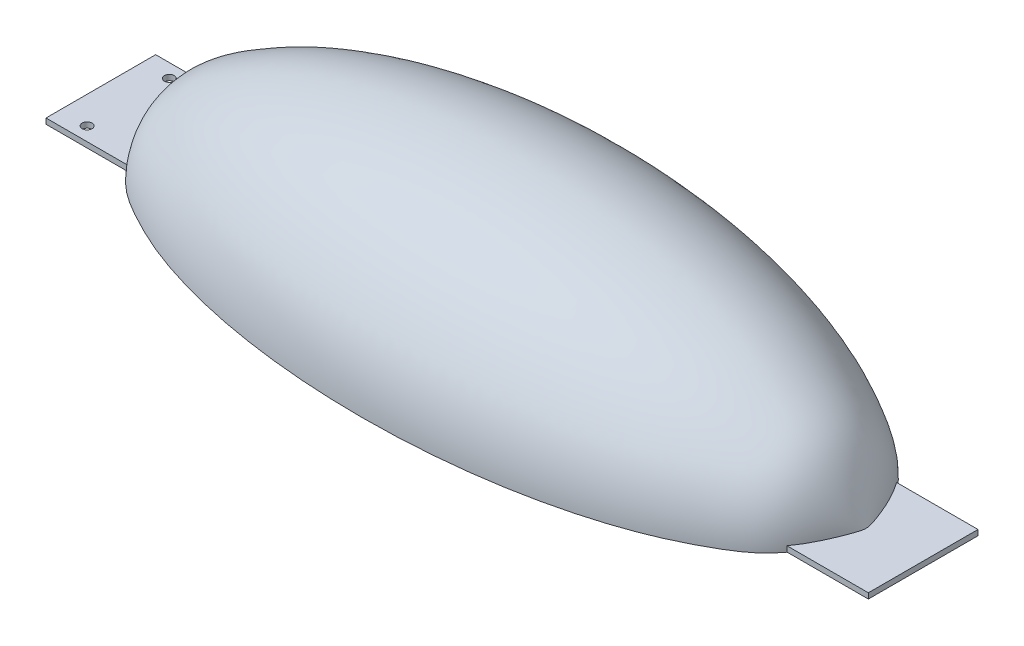
ISO-10303-21;
HEADER;
FILE_DESCRIPTION(('STEP AP214'),'2;1');
FILE_NAME('part.step','',(''),(''),'','','');
FILE_SCHEMA(('AUTOMOTIVE_DESIGN { 1 0 10303 214 1 1 1 1 }'));
ENDSEC;
DATA;
#1=APPLICATION_CONTEXT('core data for automotive mechanical design processes');
#2=APPLICATION_PROTOCOL_DEFINITION('international standard','automotive_design',2000,#1);
#3=PRODUCT_CONTEXT('',#1,'mechanical');
#4=PRODUCT('Part','Part','',(#3));
#5=PRODUCT_RELATED_PRODUCT_CATEGORY('part','',(#4));
#6=PRODUCT_DEFINITION_FORMATION('','',#4);
#7=PRODUCT_DEFINITION_CONTEXT('part definition',#1,'design');
#8=PRODUCT_DEFINITION('design','',#6,#7);
#9=PRODUCT_DEFINITION_SHAPE('','',#8);
#10=(LENGTH_UNIT() NAMED_UNIT(*) SI_UNIT(.MILLI.,.METRE.));
#11=(NAMED_UNIT(*) PLANE_ANGLE_UNIT() SI_UNIT($,.RADIAN.));
#12=(NAMED_UNIT(*) SI_UNIT($,.STERADIAN.) SOLID_ANGLE_UNIT());
#13=UNCERTAINTY_MEASURE_WITH_UNIT(LENGTH_MEASURE(1.E-05),#10,'distance_accuracy_value','');
#14=(GEOMETRIC_REPRESENTATION_CONTEXT(3) GLOBAL_UNCERTAINTY_ASSIGNED_CONTEXT((#13)) GLOBAL_UNIT_ASSIGNED_CONTEXT((#10,
#11,#12)) REPRESENTATION_CONTEXT('',''));
#15=CARTESIAN_POINT('',(0.,0.,0.));
#16=DIRECTION('',(0.,0.,1.));
#17=DIRECTION('',(1.,0.,0.));
#18=AXIS2_PLACEMENT_3D('',#15,#16,#17);
#19=CARTESIAN_POINT('',(0.,0.,0.));
#20=CARTESIAN_POINT('',(-3.34728760807037,8.83049174672856,0.));
#21=CARTESIAN_POINT('',(-8.63705775619277,22.7854538248196,0.));
#22=CARTESIAN_POINT('',(-25.5609998762051,33.0215736095755,0.));
#23=CARTESIAN_POINT('',(-38.692183286296,39.4341991765542,0.));
#24=CARTESIAN_POINT('',(-51.8523498148389,44.1237948844508,0.));
#25=CARTESIAN_POINT('',(-64.8994842203684,47.7493668098657,0.));
#26=CARTESIAN_POINT('',(-77.9365733841035,50.5149561525374,0.));
#27=CARTESIAN_POINT('',(-90.9583058600053,52.5666161858214,0.));
#28=CARTESIAN_POINT('',(-103.974926364924,53.9838858887368,0.));
#29=CARTESIAN_POINT('',(-116.988117971928,54.8167434728398,0.));
#30=CARTESIAN_POINT('',(-130.,55.09154413207,0.));
#31=CARTESIAN_POINT('',(-143.011882028072,54.8167434728398,0.));
#32=CARTESIAN_POINT('',(-156.025073635076,53.9838858887368,0.));
#33=CARTESIAN_POINT('',(-169.041694139995,52.5666161858215,0.));
#34=CARTESIAN_POINT('',(-182.063426615897,50.5149561525374,0.));
#35=CARTESIAN_POINT('',(-195.100515779632,47.7493668098658,0.));
#36=CARTESIAN_POINT('',(-208.147650185161,44.1237948844508,0.));
#37=CARTESIAN_POINT('',(-221.307816713704,39.4341991765542,0.));
#38=CARTESIAN_POINT('',(-234.439000123795,33.0215736095755,0.));
#39=CARTESIAN_POINT('',(-251.362942243807,22.7854538248196,0.));
#40=CARTESIAN_POINT('',(-256.65271239193,8.83049174672855,0.));
#41=CARTESIAN_POINT('',(-260.,0.,0.));
#42=B_SPLINE_CURVE_WITH_KNOTS('',3,(#19,#20,#21,#22,#23,#24,#25,#26,#27,#28,#29,#30,#31,#32,#33,
#34,#35,#36,#37,#38,#39,#40,#41),.UNSPECIFIED.,.F.,.F.,(4,1,1,1,1,1,1,1,1,1,1,1,1,1,1,1,1,1,1,1,
4),(0.,0.0906486460239755,0.143253451107467,0.191238799417706,0.237211897792108,
0.282076784868716,0.326262315991929,0.370011280436096,0.41347975066247,0.456779596040452,0.5,
0.543220403959548,0.58652024933753,0.629988719563904,0.673737684008071,0.717923215131284,
0.762788102207892,0.808761200582294,0.856746548892532,0.909351353976025,1.),.UNSPECIFIED.);
#43=CARTESIAN_POINT('',(10.,0.,0.));
#44=DIRECTION('',(1.,0.,0.));
#45=AXIS1_PLACEMENT('',#43,#44);
#46=SURFACE_OF_REVOLUTION('',#42,#45);
#47=CARTESIAN_POINT('',(-250.309050644008,2.,-20.));
#48=CARTESIAN_POINT('',(-250.478001383898,2.,-19.7691809663855));
#49=CARTESIAN_POINT('',(-250.644336825609,2.,-19.5364561920275));
#50=CARTESIAN_POINT('',(-250.971881417231,2.,-19.0675496964035));
#51=CARTESIAN_POINT('',(-251.133092384855,2.,-18.8313692453147));
#52=CARTESIAN_POINT('',(-251.450587417086,2.,-18.3557787321068));
#53=CARTESIAN_POINT('',(-251.606872281404,2.,-18.1163692033064));
#54=CARTESIAN_POINT('',(-251.914716801252,2.,-17.6345432726316));
#55=CARTESIAN_POINT('',(-252.066276598858,2.,-17.3921269614738));
#56=CARTESIAN_POINT('',(-252.362672385244,2.,-16.9080976009549));
#57=CARTESIAN_POINT('',(-252.507574398941,2.,-16.6665249480298));
#58=CARTESIAN_POINT('',(-252.793172089984,2.,-16.1808861484684));
#59=CARTESIAN_POINT('',(-252.933867488965,2.,-15.9368198382459));
#60=CARTESIAN_POINT('',(-253.211236957906,2.,-15.4464019747639));
#61=CARTESIAN_POINT('',(-253.347910874852,2.,-15.200050335016));
#62=CARTESIAN_POINT('',(-253.617418150724,2.,-14.7052689766137));
#63=CARTESIAN_POINT('',(-253.750251646913,2.,-14.4568393326403));
#64=CARTESIAN_POINT('',(-254.066849373885,2.,-13.854185075417));
#65=CARTESIAN_POINT('',(-254.248780868304,2.,-13.4989966764625));
#66=CARTESIAN_POINT('',(-254.605873424121,2.,-12.7852344627415));
#67=CARTESIAN_POINT('',(-254.781034403697,2.,-12.4266606071271));
#68=CARTESIAN_POINT('',(-255.125128950887,2.,-11.7064792757082));
#69=CARTESIAN_POINT('',(-255.294061648743,2.,-11.3448713848024));
#70=CARTESIAN_POINT('',(-255.626192570108,2.,-10.6189537094252));
#71=CARTESIAN_POINT('',(-255.789389721235,2.,-10.2546434349456));
#72=CARTESIAN_POINT('',(-256.112626269146,2.,-9.51873573071706));
#73=CARTESIAN_POINT('',(-256.272593004099,2.,-9.14710641792657));
#74=CARTESIAN_POINT('',(-256.587404593219,2.,-8.40172233734678));
#75=CARTESIAN_POINT('',(-256.742249867676,2.,-8.02796774693184));
#76=CARTESIAN_POINT('',(-257.046995377677,2.,-7.2785883437464));
#77=CARTESIAN_POINT('',(-257.196897174187,2.,-6.90296416528669));
#78=CARTESIAN_POINT('',(-257.491674818638,2.,-6.1499886303511));
#79=CARTESIAN_POINT('',(-257.636553450071,2.,-5.77263836595591));
#80=CARTESIAN_POINT('',(-257.835638107045,2.,-5.24237291666156));
#81=CARTESIAN_POINT('',(-257.892201373893,2.,-5.0903407664297));
#82=CARTESIAN_POINT('',(-258.004322468176,2.,-4.78589465521209));
#83=CARTESIAN_POINT('',(-258.059880231494,2.,-4.63348067057817));
#84=CARTESIAN_POINT('',(-258.169870565432,2.,-4.32816970223578));
#85=CARTESIAN_POINT('',(-258.224302620953,2.,-4.17527253277409));
#86=CARTESIAN_POINT('',(-258.331845424168,2.,-3.86886614149191));
#87=CARTESIAN_POINT('',(-258.384954999361,2.,-3.71535650739729));
#88=CARTESIAN_POINT('',(-258.489547234221,2.,-3.40755662990173));
#89=CARTESIAN_POINT('',(-258.541027656995,2.,-3.25326562424601));
#90=CARTESIAN_POINT('',(-258.64071794378,2.,-2.94724771677224));
#91=CARTESIAN_POINT('',(-258.688974044679,2.,-2.79553594136142));
#92=CARTESIAN_POINT('',(-258.782657036082,2.,-2.49123916063963));
#93=CARTESIAN_POINT('',(-258.828083982938,2.,-2.33865417278745));
#94=CARTESIAN_POINT('',(-258.914950607262,2.,-2.03252667591489));
#95=CARTESIAN_POINT('',(-258.956394741742,2.,-1.87898544688231));
#96=CARTESIAN_POINT('',(-259.033600764058,2.,-1.57071813982823));
#97=CARTESIAN_POINT('',(-259.069371534991,2.,-1.4159943197589));
#98=CARTESIAN_POINT('',(-259.132820475644,2.,-1.10490573689341));
#99=CARTESIAN_POINT('',(-259.160502508904,2.,-0.948541794585765));
#100=CARTESIAN_POINT('',(-259.195993636137,2.,-0.696000135623717));
#101=CARTESIAN_POINT('',(-259.207337254486,2.,-0.600322094010236));
#102=CARTESIAN_POINT('',(-259.225242297539,2.,-0.408512786124293));
#103=CARTESIAN_POINT('',(-259.231803937653,2.,-0.312381540463362));
#104=CARTESIAN_POINT('',(-259.239692212206,2.,-0.119968936484718));
#105=CARTESIAN_POINT('',(-259.241022596909,2.,-0.0236877352253521));
#106=CARTESIAN_POINT('',(-259.238361464156,2.,0.168704377774701));
#107=CARTESIAN_POINT('',(-259.234375193338,2.,0.264815363814678));
#108=CARTESIAN_POINT('',(-259.221325779283,2.,0.457446820096666));
#109=CARTESIAN_POINT('',(-259.212222803524,2.,0.553964532722928));
#110=CARTESIAN_POINT('',(-259.189489253683,2.,0.746536588196075));
#111=CARTESIAN_POINT('',(-259.175854899861,2.,0.842590476067346));
#112=CARTESIAN_POINT('',(-259.144757833675,2.,1.03418286650689));
#113=CARTESIAN_POINT('',(-259.127290643909,2.,1.12972063129189));
#114=CARTESIAN_POINT('',(-259.089226328873,2.,1.32023125965645));
#115=CARTESIAN_POINT('',(-259.068627056931,1.99999999999999,1.41520368901551));
#116=CARTESIAN_POINT('',(-259.018430410895,1.99999999999999,1.63271285144118));
#117=CARTESIAN_POINT('',(-258.987978499037,2.,1.75505112648353));
#118=CARTESIAN_POINT('',(-258.923924688767,2.,1.99890524389586));
#119=CARTESIAN_POINT('',(-258.890322421197,2.,2.12042098808878));
#120=CARTESIAN_POINT('',(-258.820753905258,2.,2.36271727344103));
#121=CARTESIAN_POINT('',(-258.784788611674,2.,2.4834980902572));
#122=CARTESIAN_POINT('',(-258.711024224576,2.,2.72449998299642));
#123=CARTESIAN_POINT('',(-258.673225069623,2.,2.84472104001846));
#124=CARTESIAN_POINT('',(-258.557634243335,2.,3.20486437608793));
#125=CARTESIAN_POINT('',(-258.477699087933,2.,3.44409769927359));
#126=CARTESIAN_POINT('',(-258.313980264613,2.,3.92141335786969));
#127=CARTESIAN_POINT('',(-258.230194009556,2.,4.15949479717849));
#128=CARTESIAN_POINT('',(-258.059747493118,2.,4.63471106554169));
#129=CARTESIAN_POINT('',(-257.973086321096,2.,4.87184556748117));
#130=CARTESIAN_POINT('',(-257.797445237254,2.,5.34521974952492));
#131=CARTESIAN_POINT('',(-257.708465608573,2.,5.5814595348972));
#132=CARTESIAN_POINT('',(-257.527563165618,2.,6.05545338282216));
#133=CARTESIAN_POINT('',(-257.435620098003,2.,6.29319971123576));
#134=CARTESIAN_POINT('',(-257.249827227634,2.,6.76773442660109));
#135=CARTESIAN_POINT('',(-257.155978950273,2.,7.00452341098628));
#136=CARTESIAN_POINT('',(-256.966394734895,2.,7.47719546839438));
#137=CARTESIAN_POINT('',(-256.870659848072,2.,7.71307896302847));
#138=CARTESIAN_POINT('',(-256.677263928358,2.,8.18396809287728));
#139=CARTESIAN_POINT('',(-256.579603513316,2.,8.41897398180426));
#140=CARTESIAN_POINT('',(-256.382278953887,2.,8.88811993199698));
#141=CARTESIAN_POINT('',(-256.282614979978,2.,9.12226006493765));
#142=CARTESIAN_POINT('',(-256.081177860005,2.,9.58967456850021));
#143=CARTESIAN_POINT('',(-255.97940438793,2.,9.82294879863304));
#144=CARTESIAN_POINT('',(-255.746547585351,2.,10.3498916555859));
#145=CARTESIAN_POINT('',(-255.614809774354,2.,10.6432715224734));
#146=CARTESIAN_POINT('',(-255.347554020925,2.,11.2284353752421));
#147=CARTESIAN_POINT('',(-255.212034710712,2.,11.5202187367966));
#148=CARTESIAN_POINT('',(-254.9369854495,2.,12.10195306111));
#149=CARTESIAN_POINT('',(-254.797454801961,2.,12.3919036948348));
#150=CARTESIAN_POINT('',(-254.51413454604,2.,12.9697266446384));
#151=CARTESIAN_POINT('',(-254.370344841288,2.,13.2575989135064));
#152=CARTESIAN_POINT('',(-254.078243559249,2.,13.8310120938761));
#153=CARTESIAN_POINT('',(-253.929932358062,2.,14.1165531967936));
#154=CARTESIAN_POINT('',(-253.628513131954,2.,14.6850452511039));
#155=CARTESIAN_POINT('',(-253.475405759902,2.,14.9679965483107));
#156=CARTESIAN_POINT('',(-253.168513230073,2.,15.5230790458907));
#157=CARTESIAN_POINT('',(-253.014871004611,2.,15.7952892116582));
#158=CARTESIAN_POINT('',(-252.702522257041,2.,16.336761618489));
#159=CARTESIAN_POINT('',(-252.543816146824,2.,16.6060240969338));
#160=CARTESIAN_POINT('',(-252.221068569377,2.,17.1413421130794));
#161=CARTESIAN_POINT('',(-252.05702700197,2.,17.4073975904385));
#162=CARTESIAN_POINT('',(-251.72333225987,2.,17.9360388794079));
#163=CARTESIAN_POINT('',(-251.553678031275,2.,18.1986240262839));
#164=CARTESIAN_POINT('',(-251.208475271184,2.,18.7200600593717));
#165=CARTESIAN_POINT('',(-251.032924207145,2.,18.9789092710625));
#166=CARTESIAN_POINT('',(-250.675646158141,2.,19.4926012938187));
#167=CARTESIAN_POINT('',(-250.493914560872,2.,19.7474408956102));
#168=CARTESIAN_POINT('',(-250.309050644008,2.00000000000001,20.));
#169=B_SPLINE_CURVE_WITH_KNOTS('',3,(#47,#48,#49,#50,#51,#52,#53,#54,#55,#56,#57,#58,#59,#60,
#61,#62,#63,#64,#65,#66,#67,#68,#69,#70,#71,#72,#73,#74,#75,#76,#77,#78,#79,#80,#81,#82,#83,#84,
#85,#86,#87,#88,#89,#90,#91,#92,#93,#94,#95,#96,#97,#98,#99,#100,#101,#102,#103,#104,#105,#106,
#107,#108,#109,#110,#111,#112,#113,#114,#115,#116,#117,#118,#119,#120,#121,#122,#123,#124,#125,
#126,#127,#128,#129,#130,#131,#132,#133,#134,#135,#136,#137,#138,#139,#140,#141,#142,#143,#144,
#145,#146,#147,#148,#149,#150,#151,#152,#153,#154,#155,#156,#157,#158,#159,#160,#161,#162,#163,
#164,#165,#166,#167,#168),.UNSPECIFIED.,.F.,.F.,(4,2,2,2,2,2,2,2,2,2,2,2,2,2,2,2,2,2,2,2,2,2,2,
2,2,2,2,2,2,2,2,2,2,2,2,2,2,2,2,2,2,2,2,2,2,2,2,2,2,2,2,2,2,2,2,2,2,2,2,2,4),(0.,
0.858106814571358,1.71590577253736,2.5735647492429,3.43119791251744,4.2762482191728,
5.12135432247798,5.96649254044273,6.8116005145965,8.00873079528431,9.20587553874638,
10.4031868306414,11.6007208066287,12.8144672813608,14.02811390236,15.2413735564489,
16.4539497965115,16.9405873019487,17.4272557306537,17.9141421302539,18.4014458477312,
18.889391931276,19.3669763028702,19.8445511588922,20.3215851994186,20.797864786327,
21.273916507661,21.5628601143324,21.8517907043573,22.1405141235692,22.4289528323458,
22.7196687119524,23.0106276964047,23.3019283971304,23.5934296575611,23.9715838532169,
24.3497824163232,24.7278290962741,25.105888450211,25.8625359665132,26.6196994420597,
27.3771050859677,28.1344186618474,28.8991260260274,29.663243559271,30.4269467438978,
31.1904087418137,31.9538060511373,32.717322232596,33.6820972823593,34.6472259376011,
35.6125232051471,36.5778423311566,37.5430813794942,38.5081896029243,39.4458688980326,
40.3834721166226,41.3210929493581,42.2588908516175,43.1970967977563,44.1360189566032),.UNSPECIFIED.);
#170=CARTESIAN_POINT('',(-250.309050644008,2.,-20.));
#171=VERTEX_POINT('',#170);
#172=CARTESIAN_POINT('',(-250.309050644008,2.,20.));
#173=VERTEX_POINT('',#172);
#174=EDGE_CURVE('E11',#171,#173,#169,.T.);
#175=ORIENTED_EDGE('',*,*,#174,.T.);
#176=CARTESIAN_POINT('',(-250.309050644008,2.,20.));
#177=CARTESIAN_POINT('',(-250.333418906554,1.66711202578357,20.));
#178=CARTESIAN_POINT('',(-250.351697099299,1.33400137200873,20.));
#179=CARTESIAN_POINT('',(-250.376073345186,0.667334705342215,20.));
#180=CARTESIAN_POINT('',(-250.382171398328,0.333778692450544,20.));
#181=CARTESIAN_POINT('',(-250.38217938167,4.57966997657877E-13,20.));
#182=B_SPLINE_CURVE_WITH_KNOTS('',3,(#176,#177,#178,#179,#180,#181),.UNSPECIFIED.,.F.,.F.,(4,2,
4),(0.,1.0008352511252,2.00167050225041),.UNSPECIFIED.);
#183=CARTESIAN_POINT('',(-250.382179381663,0.,20.));
#184=VERTEX_POINT('',#183);
#185=EDGE_CURVE('E111',#173,#184,#182,.T.);
#186=ORIENTED_EDGE('',*,*,#185,.T.);
#187=CARTESIAN_POINT('',(0.,0.,0.));
#188=CARTESIAN_POINT('',(-3.34728760807037,0.,8.83049174672856));
#189=CARTESIAN_POINT('',(-8.63705775619277,0.,22.7854538248196));
#190=CARTESIAN_POINT('',(-25.5609998762051,0.,33.0215736095755));
#191=CARTESIAN_POINT('',(-38.692183286296,0.,39.4341991765542));
#192=CARTESIAN_POINT('',(-51.8523498148389,0.,44.1237948844508));
#193=CARTESIAN_POINT('',(-64.8994842203684,0.,47.7493668098657));
#194=CARTESIAN_POINT('',(-77.9365733841035,0.,50.5149561525374));
#195=CARTESIAN_POINT('',(-90.9583058600053,0.,52.5666161858214));
#196=CARTESIAN_POINT('',(-103.974926364924,0.,53.9838858887368));
#197=CARTESIAN_POINT('',(-116.988117971928,0.,54.8167434728398));
#198=CARTESIAN_POINT('',(-130.,0.,55.09154413207));
#199=CARTESIAN_POINT('',(-143.011882028072,0.,54.8167434728398));
#200=CARTESIAN_POINT('',(-156.025073635076,0.,53.9838858887368));
#201=CARTESIAN_POINT('',(-169.041694139995,0.,52.5666161858215));
#202=CARTESIAN_POINT('',(-182.063426615897,0.,50.5149561525374));
#203=CARTESIAN_POINT('',(-195.100515779632,0.,47.7493668098658));
#204=CARTESIAN_POINT('',(-208.147650185161,0.,44.1237948844508));
#205=CARTESIAN_POINT('',(-221.307816713704,0.,39.4341991765542));
#206=CARTESIAN_POINT('',(-234.439000123795,0.,33.0215736095755));
#207=CARTESIAN_POINT('',(-251.362942243807,0.,22.7854538248196));
#208=CARTESIAN_POINT('',(-256.65271239193,0.,8.83049174672855));
#209=CARTESIAN_POINT('',(-260.,0.,0.));
#210=B_SPLINE_CURVE_WITH_KNOTS('',3,(#187,#188,#189,#190,#191,#192,#193,#194,#195,#196,#197,
#198,#199,#200,#201,#202,#203,#204,#205,#206,#207,#208,#209),.UNSPECIFIED.,.F.,.F.,(4,1,1,1,1,1,
1,1,1,1,1,1,1,1,1,1,1,1,1,1,4),(0.,0.0906486460239755,0.143253451107467,0.191238799417706,
0.237211897792108,0.282076784868716,0.326262315991929,0.370011280436096,0.41347975066247,
0.456779596040452,0.5,0.543220403959548,0.58652024933753,0.629988719563904,0.673737684008071,
0.717923215131284,0.762788102207892,0.808761200582294,0.856746548892532,0.909351353976025,1.),.UNSPECIFIED.);
#211=CARTESIAN_POINT('',(-9.61782061833673,0.,20.0000000000086));
#212=VERTEX_POINT('',#211);
#213=EDGE_CURVE('E217',#184,#212,#210,.F.);
#214=ORIENTED_EDGE('',*,*,#213,.T.);
#215=CARTESIAN_POINT('',(-9.61782061833673,0.,20.0000000000043));
#216=CARTESIAN_POINT('',(-9.61782860167489,0.333778692450202,20.0000000000021));
#217=CARTESIAN_POINT('',(-9.62392665481523,0.667334705341969,20.0000000000007));
#218=CARTESIAN_POINT('',(-9.64830290070032,1.33400137200864,19.9999999999993));
#219=CARTESIAN_POINT('',(-9.66658109344506,1.66711202578354,19.9999999999993));
#220=CARTESIAN_POINT('',(-9.69094935599199,2.,20.));
#221=B_SPLINE_CURVE_WITH_KNOTS('',3,(#215,#216,#217,#218,#219,#220),.UNSPECIFIED.,.F.,.F.,(4,2,
4),(0.,1.00083525112538,2.00167050225075),.UNSPECIFIED.);
#222=CARTESIAN_POINT('',(-9.69094935599199,2.,20.));
#223=VERTEX_POINT('',#222);
#224=EDGE_CURVE('E130',#212,#223,#221,.T.);
#225=ORIENTED_EDGE('',*,*,#224,.T.);
#226=CARTESIAN_POINT('',(-9.69094935599199,2.,20.));
#227=CARTESIAN_POINT('',(-9.52199861610221,2.,19.7691809663854));
#228=CARTESIAN_POINT('',(-9.35566317439129,2.,19.5364561920275));
#229=CARTESIAN_POINT('',(-9.02811858276898,2.,19.0675496964035));
#230=CARTESIAN_POINT('',(-8.86690761514511,2.,18.8313692453147));
#231=CARTESIAN_POINT('',(-8.54941258291422,2.,18.3557787321069));
#232=CARTESIAN_POINT('',(-8.39312771859587,2.,18.1163692033064));
#233=CARTESIAN_POINT('',(-8.08528319874785,2.,17.6345432726317));
#234=CARTESIAN_POINT('',(-7.93372340114255,2.,17.3921269614738));
#235=CARTESIAN_POINT('',(-7.6373276147566,2.,16.9080976009549));
#236=CARTESIAN_POINT('',(-7.49242560105928,2.,16.6665249480298));
#237=CARTESIAN_POINT('',(-7.20682791001572,2.,16.1808861484685));
#238=CARTESIAN_POINT('',(-7.06613251103553,2.,15.936819838246));
#239=CARTESIAN_POINT('',(-6.7887630420936,2.,15.446401974764));
#240=CARTESIAN_POINT('',(-6.65208912514853,2.,15.200050335016));
#241=CARTESIAN_POINT('',(-6.382581849276,2.,14.7052689766138));
#242=CARTESIAN_POINT('',(-6.24974835308676,2.,14.4568393326403));
#243=CARTESIAN_POINT('',(-5.93315062611508,2.,13.8541850754171));
#244=CARTESIAN_POINT('',(-5.75121913169653,2.,13.4989966764625));
#245=CARTESIAN_POINT('',(-5.39412657587954,2.,12.7852344627416));
#246=CARTESIAN_POINT('',(-5.21896559630264,2.,12.4266606071272));
#247=CARTESIAN_POINT('',(-4.874871049113,2.,11.7064792757083));
#248=CARTESIAN_POINT('',(-4.70593835125663,2.,11.3448713848025));
#249=CARTESIAN_POINT('',(-4.37380742989254,2.,10.6189537094253));
#250=CARTESIAN_POINT('',(-4.21061027876491,2.,10.2546434349458));
#251=CARTESIAN_POINT('',(-3.88737373085408,2.,9.51873573071724));
#252=CARTESIAN_POINT('',(-3.72740699590131,2.,9.14710641792675));
#253=CARTESIAN_POINT('',(-3.41259540678102,2.,8.40172233734698));
#254=CARTESIAN_POINT('',(-3.25775013232407,2.,8.02796774693205));
#255=CARTESIAN_POINT('',(-2.95300462232314,2.,7.27858834374665));
#256=CARTESIAN_POINT('',(-2.80310282581313,2.,6.90296416528695));
#257=CARTESIAN_POINT('',(-2.5083251813618,2.,6.14998863035138));
#258=CARTESIAN_POINT('',(-2.36344654992911,2.,5.77263836595619));
#259=CARTESIAN_POINT('',(-2.16436189295491,2.,5.24237291666184));
#260=CARTESIAN_POINT('',(-2.10779862610731,2.,5.09034076642996));
#261=CARTESIAN_POINT('',(-1.99567753182372,2.,4.78589465521234));
#262=CARTESIAN_POINT('',(-1.94011976850653,2.,4.63348067057841));
#263=CARTESIAN_POINT('',(-1.8301294345679,2.,4.32816970223601));
#264=CARTESIAN_POINT('',(-1.77569737904689,2.,4.1752725327743));
#265=CARTESIAN_POINT('',(-1.66815457583185,2.,3.86886614149208));
#266=CARTESIAN_POINT('',(-1.61504500063957,2.,3.71535650739745));
#267=CARTESIAN_POINT('',(-1.51045276577906,2.,3.40755662990187));
#268=CARTESIAN_POINT('',(-1.45897234300515,2.,3.25326562424616));
#269=CARTESIAN_POINT('',(-1.35928205621971,2.,2.94724771677236));
#270=CARTESIAN_POINT('',(-1.3110259553211,2.,2.79553594136152));
#271=CARTESIAN_POINT('',(-1.21734296391808,2.,2.4912391606397));
#272=CARTESIAN_POINT('',(-1.17191601706256,2.,2.33865417278752));
#273=CARTESIAN_POINT('',(-1.08504939273768,2.,2.03252667591496));
#274=CARTESIAN_POINT('',(-1.04360525825766,2.,1.87898544688236));
#275=CARTESIAN_POINT('',(-0.966399235942185,2.,1.57071813982826));
#276=CARTESIAN_POINT('',(-0.930628465008755,2.,1.41599431975891));
#277=CARTESIAN_POINT('',(-0.867179524355995,2.,1.10490573689339));
#278=CARTESIAN_POINT('',(-0.839497491095918,2.,0.948541794585738));
#279=CARTESIAN_POINT('',(-0.804006363863311,2.,0.696000135623671));
#280=CARTESIAN_POINT('',(-0.792662745513697,2.,0.600322094010185));
#281=CARTESIAN_POINT('',(-0.774757702460949,2.,0.408512786124233));
#282=CARTESIAN_POINT('',(-0.768196062347364,2.,0.312381540463297));
#283=CARTESIAN_POINT('',(-0.760307787793779,2.,0.119968936484644));
#284=CARTESIAN_POINT('',(-0.75897740309089,2.,0.023687735225272));
#285=CARTESIAN_POINT('',(-0.761638535844459,2.,-0.168704377774791));
#286=CARTESIAN_POINT('',(-0.765624806661848,2.,-0.264815363814771));
#287=CARTESIAN_POINT('',(-0.778674220716598,2.,-0.457446820096775));
#288=CARTESIAN_POINT('',(-0.787777196475967,2.,-0.553964532723048));
#289=CARTESIAN_POINT('',(-0.810510746317198,2.,-0.746536588196204));
#290=CARTESIAN_POINT('',(-0.824145100139399,2.,-0.842590476067473));
#291=CARTESIAN_POINT('',(-0.855242166325093,2.,-1.03418286650702));
#292=CARTESIAN_POINT('',(-0.872709356091361,2.,-1.12972063129204));
#293=CARTESIAN_POINT('',(-0.910773671127534,2.,-1.32023125965661));
#294=CARTESIAN_POINT('',(-0.931372943069198,2.,-1.41520368901568));
#295=CARTESIAN_POINT('',(-0.981569589105063,2.,-1.63271285144135));
#296=CARTESIAN_POINT('',(-1.01202150096258,2.,-1.75505112648369));
#297=CARTESIAN_POINT('',(-1.07607531123316,2.,-1.99890524389602));
#298=CARTESIAN_POINT('',(-1.10967757880345,2.,-2.12042098808894));
#299=CARTESIAN_POINT('',(-1.17924609474236,2.,-2.3627172734412));
#300=CARTESIAN_POINT('',(-1.2152113883256,2.,-2.48349809025738));
#301=CARTESIAN_POINT('',(-1.28897577542443,2.,-2.72449998299662));
#302=CARTESIAN_POINT('',(-1.32677493037758,2.,-2.84472104001866));
#303=CARTESIAN_POINT('',(-1.44236575666488,2.,-3.20486437608814));
#304=CARTESIAN_POINT('',(-1.52230091206675,2.,-3.44409769927381));
#305=CARTESIAN_POINT('',(-1.68601973538709,2.,-3.92141335786993));
#306=CARTESIAN_POINT('',(-1.76980599044384,2.,-4.15949479717875));
#307=CARTESIAN_POINT('',(-1.94025250688191,2.,-4.63471106554197));
#308=CARTESIAN_POINT('',(-2.02691367890384,2.,-4.87184556748146));
#309=CARTESIAN_POINT('',(-2.20255476274643,2.,-5.34521974952523));
#310=CARTESIAN_POINT('',(-2.2915343914273,2.,-5.58145953489753));
#311=CARTESIAN_POINT('',(-2.47243683438246,2.,-6.05545338282252));
#312=CARTESIAN_POINT('',(-2.56437990199667,2.,-6.29319971123613));
#313=CARTESIAN_POINT('',(-2.75017277236633,2.,-6.76773442660147));
#314=CARTESIAN_POINT('',(-2.84402104972716,2.,-7.00452341098667));
#315=CARTESIAN_POINT('',(-3.03360526510538,2.,-7.4771954683948));
#316=CARTESIAN_POINT('',(-3.12934015192878,2.,-7.71307896302889));
#317=CARTESIAN_POINT('',(-3.32273607164242,2.,-8.18396809287774));
#318=CARTESIAN_POINT('',(-3.42039648668408,2.,-8.41897398180474));
#319=CARTESIAN_POINT('',(-3.61772104611339,2.,-8.88811993199749));
#320=CARTESIAN_POINT('',(-3.71738502002272,2.,-9.12226006493817));
#321=CARTESIAN_POINT('',(-3.91882213999486,2.,-9.58967456850076));
#322=CARTESIAN_POINT('',(-4.02059561207009,2.,-9.82294879863361));
#323=CARTESIAN_POINT('',(-4.25345241464937,2.,-10.3498916555865));
#324=CARTESIAN_POINT('',(-4.38519022564677,2.,-10.6432715224739));
#325=CARTESIAN_POINT('',(-4.65244597907546,2.,-11.2284353752426));
#326=CARTESIAN_POINT('',(-4.78796528928847,2.,-11.5202187367971));
#327=CARTESIAN_POINT('',(-5.0630145504999,2.,-12.1019530611104));
#328=CARTESIAN_POINT('',(-5.20254519803898,2.,-12.3919036948352));
#329=CARTESIAN_POINT('',(-5.48586545396059,2.,-12.9697266446388));
#330=CARTESIAN_POINT('',(-5.62965515871269,2.,-13.2575989135069));
#331=CARTESIAN_POINT('',(-5.92175644075136,2.,-13.8310120938765));
#332=CARTESIAN_POINT('',(-6.07006764193827,2.,-14.1165531967939));
#333=CARTESIAN_POINT('',(-6.37148686804586,2.,-14.6850452511041));
#334=CARTESIAN_POINT('',(-6.52459424009841,2.,-14.967996548311));
#335=CARTESIAN_POINT('',(-6.83148676992733,2.,-15.523079045891));
#336=CARTESIAN_POINT('',(-6.98512899538901,2.,-15.7952892116584));
#337=CARTESIAN_POINT('',(-7.29747774295943,2.,-16.3367616184892));
#338=CARTESIAN_POINT('',(-7.4561838531764,2.,-16.606024096934));
#339=CARTESIAN_POINT('',(-7.77893143062355,2.,-17.1413421130796));
#340=CARTESIAN_POINT('',(-7.94297299802962,2.,-17.4073975904386));
#341=CARTESIAN_POINT('',(-8.27666774013025,2.,-17.936038879408));
#342=CARTESIAN_POINT('',(-8.44632196872542,2.,-18.198624026284));
#343=CARTESIAN_POINT('',(-8.79152472881631,2.,-18.7200600593718));
#344=CARTESIAN_POINT('',(-8.96707579285476,2.,-18.9789092710625));
#345=CARTESIAN_POINT('',(-9.32435384185865,2.,-19.4926012938187));
#346=CARTESIAN_POINT('',(-9.50608543912822,2.,-19.7474408956102));
#347=CARTESIAN_POINT('',(-9.69094935599199,1.99999999999999,-20.));
#348=B_SPLINE_CURVE_WITH_KNOTS('',3,(#226,#227,#228,#229,#230,#231,#232,#233,#234,#235,#236,
#237,#238,#239,#240,#241,#242,#243,#244,#245,#246,#247,#248,#249,#250,#251,#252,#253,#254,#255,
#256,#257,#258,#259,#260,#261,#262,#263,#264,#265,#266,#267,#268,#269,#270,#271,#272,#273,#274,
#275,#276,#277,#278,#279,#280,#281,#282,#283,#284,#285,#286,#287,#288,#289,#290,#291,#292,#293,
#294,#295,#296,#297,#298,#299,#300,#301,#302,#303,#304,#305,#306,#307,#308,#309,#310,#311,#312,
#313,#314,#315,#316,#317,#318,#319,#320,#321,#322,#323,#324,#325,#326,#327,#328,#329,#330,#331,
#332,#333,#334,#335,#336,#337,#338,#339,#340,#341,#342,#343,#344,#345,#346,#347),.UNSPECIFIED.,
.F.,.F.,(4,2,2,2,2,2,2,2,2,2,2,2,2,2,2,2,2,2,2,2,2,2,2,2,2,2,2,2,2,2,2,2,2,2,2,2,2,2,2,2,2,2,2,
2,2,2,2,2,2,2,2,2,2,2,2,2,2,2,2,2,4),(0.,0.858106814571334,1.71590577253737,2.57356474924285,
3.43119791251739,4.27624821917274,5.12135432247792,5.96649254044266,6.81160051459643,
8.00873079528421,9.20587553874625,10.4031868306413,11.6007208066285,12.8144672813605,
14.0281139023598,15.2413735564486,16.4539497965112,16.9405873019484,17.4272557306534,
17.9141421302537,18.401445847731,18.8893919312758,19.3669763028701,19.8445511588921,
20.3215851994185,20.7978647863269,21.273916507661,21.5628601143324,21.8517907043573,
22.1405141235693,22.4289528323459,22.7196687119525,23.0106276964048,23.3019283971305,
23.5934296575613,23.9715838532171,24.3497824163233,24.7278290962743,25.1058884502112,
25.8625359665134,26.6196994420599,27.377105085968,28.1344186618478,28.8991260260278,
29.6632435592715,30.4269467438983,31.1904087418143,31.9538060511379,32.7173222325966,
33.6820972823598,34.6472259376016,35.6125232051476,36.577842331157,37.5430813794945,
38.5081896029246,39.4458688980328,40.3834721166228,41.3210929493582,42.2588908516176,
43.1970967977563,44.1360189566032),.UNSPECIFIED.);
#349=CARTESIAN_POINT('',(-9.69094935599198,2.,-20.));
#350=VERTEX_POINT('',#349);
#351=EDGE_CURVE('E49',#223,#350,#348,.T.);
#352=ORIENTED_EDGE('',*,*,#351,.T.);
#353=CARTESIAN_POINT('',(-9.69094935599198,2.,-20.));
#354=CARTESIAN_POINT('',(-9.6665810934461,1.66711202578357,-20.));
#355=CARTESIAN_POINT('',(-9.64830290070137,1.33400137200873,-20.));
#356=CARTESIAN_POINT('',(-9.6239266548142,0.667334705342213,-20.));
#357=CARTESIAN_POINT('',(-9.61782860167176,0.333778692450543,-20.));
#358=CARTESIAN_POINT('',(-9.61782061833047,4.57966997657877E-13,-20.));
#359=B_SPLINE_CURVE_WITH_KNOTS('',3,(#353,#354,#355,#356,#357,#358),.UNSPECIFIED.,.F.,.F.,(4,2,
4),(0.,1.0008352511252,2.0016705022504),.UNSPECIFIED.);
#360=CARTESIAN_POINT('',(-9.61782061833673,0.,-20.0000000000086));
#361=VERTEX_POINT('',#360);
#362=EDGE_CURVE('E127',#350,#361,#359,.T.);
#363=ORIENTED_EDGE('',*,*,#362,.T.);
#364=CARTESIAN_POINT('',(0.,0.,0.));
#365=CARTESIAN_POINT('',(-3.34728760807037,0.,-8.83049174672856));
#366=CARTESIAN_POINT('',(-8.63705775619277,0.,-22.7854538248196));
#367=CARTESIAN_POINT('',(-25.5609998762051,0.,-33.0215736095755));
#368=CARTESIAN_POINT('',(-38.692183286296,0.,-39.4341991765542));
#369=CARTESIAN_POINT('',(-51.8523498148389,0.,-44.1237948844508));
#370=CARTESIAN_POINT('',(-64.8994842203684,0.,-47.7493668098657));
#371=CARTESIAN_POINT('',(-77.9365733841035,0.,-50.5149561525374));
#372=CARTESIAN_POINT('',(-90.9583058600053,0.,-52.5666161858214));
#373=CARTESIAN_POINT('',(-103.974926364924,0.,-53.9838858887368));
#374=CARTESIAN_POINT('',(-116.988117971928,0.,-54.8167434728398));
#375=CARTESIAN_POINT('',(-130.,0.,-55.09154413207));
#376=CARTESIAN_POINT('',(-143.011882028072,0.,-54.8167434728398));
#377=CARTESIAN_POINT('',(-156.025073635076,0.,-53.9838858887368));
#378=CARTESIAN_POINT('',(-169.041694139995,0.,-52.5666161858215));
#379=CARTESIAN_POINT('',(-182.063426615897,0.,-50.5149561525374));
#380=CARTESIAN_POINT('',(-195.100515779632,0.,-47.7493668098658));
#381=CARTESIAN_POINT('',(-208.147650185161,0.,-44.1237948844508));
#382=CARTESIAN_POINT('',(-221.307816713704,0.,-39.4341991765542));
#383=CARTESIAN_POINT('',(-234.439000123795,0.,-33.0215736095755));
#384=CARTESIAN_POINT('',(-251.362942243807,0.,-22.7854538248196));
#385=CARTESIAN_POINT('',(-256.65271239193,0.,-8.83049174672855));
#386=CARTESIAN_POINT('',(-260.,0.,0.));
#387=B_SPLINE_CURVE_WITH_KNOTS('',3,(#364,#365,#366,#367,#368,#369,#370,#371,#372,#373,#374,
#375,#376,#377,#378,#379,#380,#381,#382,#383,#384,#385,#386),.UNSPECIFIED.,.F.,.F.,(4,1,1,1,1,1,
1,1,1,1,1,1,1,1,1,1,1,1,1,1,4),(0.,0.0906486460239755,0.143253451107467,0.191238799417706,
0.237211897792108,0.282076784868716,0.326262315991929,0.370011280436096,0.41347975066247,
0.456779596040452,0.5,0.543220403959548,0.58652024933753,0.629988719563904,0.673737684008071,
0.717923215131284,0.762788102207892,0.808761200582294,0.856746548892532,0.909351353976025,1.),.UNSPECIFIED.);
#388=CARTESIAN_POINT('',(-250.382179381663,0.,-20.0000000000086));
#389=VERTEX_POINT('',#388);
#390=EDGE_CURVE('E184',#361,#389,#387,.T.);
#391=ORIENTED_EDGE('',*,*,#390,.T.);
#392=CARTESIAN_POINT('',(-250.382179381663,0.,-20.0000000000043));
#393=CARTESIAN_POINT('',(-250.382171398325,0.333778692450192,-20.0000000000021));
#394=CARTESIAN_POINT('',(-250.376073345185,0.667334705341955,-20.0000000000007));
#395=CARTESIAN_POINT('',(-250.3516970993,1.33400137200861,-19.9999999999993));
#396=CARTESIAN_POINT('',(-250.333418906555,1.66711202578351,-19.9999999999993));
#397=CARTESIAN_POINT('',(-250.309050644008,1.99999999999997,-20.));
#398=B_SPLINE_CURVE_WITH_KNOTS('',3,(#392,#393,#394,#395,#396,#397),.UNSPECIFIED.,.F.,.F.,(4,2,
4),(0.,1.00083525112537,2.00167050225073),.UNSPECIFIED.);
#399=EDGE_CURVE('E60',#389,#171,#398,.T.);
#400=ORIENTED_EDGE('',*,*,#399,.T.);
#401=EDGE_LOOP('',(#175,#186,#214,#225,#352,#363,#391,#400));
#402=FACE_BOUND('',#401,.T.);
#403=ADVANCED_FACE('F39',(#402),#46,.F.);
#404=CARTESIAN_POINT('',(0.,0.,0.));
#405=DIRECTION('',(0.,-1.,0.));
#406=DIRECTION('',(0.,0.,-1.));
#407=AXIS2_PLACEMENT_3D('',#404,#405,#406);
#408=PLANE('',#407);
#409=CARTESIAN_POINT('',(-270.,0.,15.));
#410=DIRECTION('',(0.,1.,0.));
#411=DIRECTION('',(0.,0.,1.));
#412=AXIS2_PLACEMENT_3D('',#409,#410,#411);
#413=CIRCLE('',#412,1.80000000000002);
#414=CARTESIAN_POINT('',(-270.,0.,16.8));
#415=VERTEX_POINT('',#414);
#416=EDGE_CURVE('E243',#415,#415,#413,.T.);
#417=ORIENTED_EDGE('',*,*,#416,.T.);
#418=EDGE_LOOP('',(#417));
#419=FACE_BOUND('',#418,.T.);
#420=CARTESIAN_POINT('',(-270.,0.,-15.));
#421=DIRECTION('',(0.,1.,0.));
#422=DIRECTION('',(0.,0.,1.));
#423=AXIS2_PLACEMENT_3D('',#420,#421,#422);
#424=CIRCLE('',#423,1.80000000000002);
#425=CARTESIAN_POINT('',(-270.,0.,-13.2));
#426=VERTEX_POINT('',#425);
#427=EDGE_CURVE('E240',#426,#426,#424,.T.);
#428=ORIENTED_EDGE('',*,*,#427,.T.);
#429=EDGE_LOOP('',(#428));
#430=FACE_BOUND('',#429,.T.);
#431=ORIENTED_EDGE('',*,*,#390,.F.);
#432=DIRECTION('',(-1.,0.,0.));
#433=VECTOR('',#432,1.);
#434=CARTESIAN_POINT('',(-10.,0.,-20.));
#435=LINE('',#434,#433);
#436=CARTESIAN_POINT('',(20.,0.,-20.));
#437=VERTEX_POINT('',#436);
#438=EDGE_CURVE('E142',#437,#361,#435,.T.);
#439=ORIENTED_EDGE('',*,*,#438,.F.);
#440=DIRECTION('',(0.,0.,-1.));
#441=VECTOR('',#440,1.);
#442=CARTESIAN_POINT('',(20.,0.,-20.));
#443=LINE('',#442,#441);
#444=CARTESIAN_POINT('',(20.,0.,20.));
#445=VERTEX_POINT('',#444);
#446=EDGE_CURVE('E145',#445,#437,#443,.T.);
#447=ORIENTED_EDGE('',*,*,#446,.F.);
#448=DIRECTION('',(1.,0.,0.));
#449=VECTOR('',#448,1.);
#450=CARTESIAN_POINT('',(20.,0.,20.));
#451=LINE('',#450,#449);
#452=EDGE_CURVE('E148',#212,#445,#451,.T.);
#453=ORIENTED_EDGE('',*,*,#452,.F.);
#454=ORIENTED_EDGE('',*,*,#213,.F.);
#455=DIRECTION('',(1.,0.,0.));
#456=VECTOR('',#455,1.);
#457=CARTESIAN_POINT('',(-250.,0.,20.));
#458=LINE('',#457,#456);
#459=CARTESIAN_POINT('',(-280.,0.,20.));
#460=VERTEX_POINT('',#459);
#461=EDGE_CURVE('E235',#460,#184,#458,.T.);
#462=ORIENTED_EDGE('',*,*,#461,.F.);
#463=DIRECTION('',(0.,0.,1.));
#464=VECTOR('',#463,1.);
#465=CARTESIAN_POINT('',(-280.,0.,20.));
#466=LINE('',#465,#464);
#467=CARTESIAN_POINT('',(-280.,0.,-20.));
#468=VERTEX_POINT('',#467);
#469=EDGE_CURVE('E126',#468,#460,#466,.T.);
#470=ORIENTED_EDGE('',*,*,#469,.F.);
#471=DIRECTION('',(-1.,0.,0.));
#472=VECTOR('',#471,1.);
#473=CARTESIAN_POINT('',(-280.,0.,-20.));
#474=LINE('',#473,#472);
#475=EDGE_CURVE('E122',#389,#468,#474,.T.);
#476=ORIENTED_EDGE('',*,*,#475,.F.);
#477=EDGE_LOOP('',(#431,#439,#447,#453,#454,#462,#470,#476));
#478=FACE_BOUND('',#477,.T.);
#479=ADVANCED_FACE('F177',(#419,#430,#478),#408,.T.);
#480=CARTESIAN_POINT('',(20.,2.,20.));
#481=DIRECTION('',(0.,0.,-1.));
#482=DIRECTION('',(-1.,0.,0.));
#483=AXIS2_PLACEMENT_3D('',#480,#481,#482);
#484=PLANE('',#483);
#485=ORIENTED_EDGE('',*,*,#224,.F.);
#486=ORIENTED_EDGE('',*,*,#452,.T.);
#487=DIRECTION('',(0.,-1.,0.));
#488=VECTOR('',#487,1.);
#489=CARTESIAN_POINT('',(20.,2.,20.));
#490=LINE('',#489,#488);
#491=CARTESIAN_POINT('',(20.,2.,20.));
#492=VERTEX_POINT('',#491);
#493=EDGE_CURVE('E135',#492,#445,#490,.T.);
#494=ORIENTED_EDGE('',*,*,#493,.F.);
#495=DIRECTION('',(1.,0.,0.));
#496=VECTOR('',#495,1.);
#497=CARTESIAN_POINT('',(20.,2.,20.));
#498=LINE('',#497,#496);
#499=EDGE_CURVE('E146',#223,#492,#498,.T.);
#500=ORIENTED_EDGE('',*,*,#499,.F.);
#501=EDGE_LOOP('',(#485,#486,#494,#500));
#502=FACE_BOUND('',#501,.T.);
#503=ADVANCED_FACE('F266',(#502),#484,.F.);
#504=CARTESIAN_POINT('',(20.,2.,-20.));
#505=DIRECTION('',(-1.,0.,0.));
#506=DIRECTION('',(0.,0.,1.));
#507=AXIS2_PLACEMENT_3D('',#504,#505,#506);
#508=PLANE('',#507);
#509=ORIENTED_EDGE('',*,*,#446,.T.);
#510=DIRECTION('',(0.,-1.,0.));
#511=VECTOR('',#510,1.);
#512=CARTESIAN_POINT('',(20.,2.,-20.));
#513=LINE('',#512,#511);
#514=CARTESIAN_POINT('',(20.,2.,-20.));
#515=VERTEX_POINT('',#514);
#516=EDGE_CURVE('E138',#515,#437,#513,.T.);
#517=ORIENTED_EDGE('',*,*,#516,.F.);
#518=DIRECTION('',(0.,0.,-1.));
#519=VECTOR('',#518,1.);
#520=CARTESIAN_POINT('',(20.,2.,-20.));
#521=LINE('',#520,#519);
#522=EDGE_CURVE('E152',#492,#515,#521,.T.);
#523=ORIENTED_EDGE('',*,*,#522,.F.);
#524=ORIENTED_EDGE('',*,*,#493,.T.);
#525=EDGE_LOOP('',(#509,#517,#523,#524));
#526=FACE_BOUND('',#525,.T.);
#527=ADVANCED_FACE('F172',(#526),#508,.F.);
#528=CARTESIAN_POINT('',(-10.,2.,-20.));
#529=DIRECTION('',(0.,0.,1.));
#530=DIRECTION('',(1.,0.,0.));
#531=AXIS2_PLACEMENT_3D('',#528,#529,#530);
#532=PLANE('',#531);
#533=ORIENTED_EDGE('',*,*,#362,.F.);
#534=DIRECTION('',(-1.,0.,0.));
#535=VECTOR('',#534,1.);
#536=CARTESIAN_POINT('',(-10.,2.,-20.));
#537=LINE('',#536,#535);
#538=EDGE_CURVE('E141',#515,#350,#537,.T.);
#539=ORIENTED_EDGE('',*,*,#538,.F.);
#540=ORIENTED_EDGE('',*,*,#516,.T.);
#541=ORIENTED_EDGE('',*,*,#438,.T.);
#542=EDGE_LOOP('',(#533,#539,#540,#541));
#543=FACE_BOUND('',#542,.T.);
#544=ADVANCED_FACE('F166',(#543),#532,.F.);
#545=CARTESIAN_POINT('',(0.,2.,0.));
#546=DIRECTION('',(0.,-1.,0.));
#547=DIRECTION('',(0.,0.,-1.));
#548=AXIS2_PLACEMENT_3D('',#545,#546,#547);
#549=PLANE('',#548);
#550=ORIENTED_EDGE('',*,*,#351,.F.);
#551=ORIENTED_EDGE('',*,*,#499,.T.);
#552=ORIENTED_EDGE('',*,*,#522,.T.);
#553=ORIENTED_EDGE('',*,*,#538,.T.);
#554=EDGE_LOOP('',(#550,#551,#552,#553));
#555=FACE_BOUND('',#554,.T.);
#556=ADVANCED_FACE('F171',(#555),#549,.F.);
#557=CARTESIAN_POINT('',(-280.,2.,20.));
#558=DIRECTION('',(1.,0.,0.));
#559=DIRECTION('',(0.,0.,-1.));
#560=AXIS2_PLACEMENT_3D('',#557,#558,#559);
#561=PLANE('',#560);
#562=ORIENTED_EDGE('',*,*,#469,.T.);
#563=DIRECTION('',(0.,-1.,0.));
#564=VECTOR('',#563,1.);
#565=CARTESIAN_POINT('',(-280.,2.,20.));
#566=LINE('',#565,#564);
#567=CARTESIAN_POINT('',(-280.,2.,20.));
#568=VERTEX_POINT('',#567);
#569=EDGE_CURVE('E109',#568,#460,#566,.T.);
#570=ORIENTED_EDGE('',*,*,#569,.F.);
#571=DIRECTION('',(0.,0.,1.));
#572=VECTOR('',#571,1.);
#573=CARTESIAN_POINT('',(-280.,2.,20.));
#574=LINE('',#573,#572);
#575=CARTESIAN_POINT('',(-280.,2.,-20.));
#576=VERTEX_POINT('',#575);
#577=EDGE_CURVE('E114',#576,#568,#574,.T.);
#578=ORIENTED_EDGE('',*,*,#577,.F.);
#579=DIRECTION('',(0.,-1.,0.));
#580=VECTOR('',#579,1.);
#581=CARTESIAN_POINT('',(-280.,2.,-20.));
#582=LINE('',#581,#580);
#583=EDGE_CURVE('E128',#576,#468,#582,.T.);
#584=ORIENTED_EDGE('',*,*,#583,.T.);
#585=EDGE_LOOP('',(#562,#570,#578,#584));
#586=FACE_BOUND('',#585,.T.);
#587=ADVANCED_FACE('F124',(#586),#561,.F.);
#588=CARTESIAN_POINT('',(-250.,2.,20.));
#589=DIRECTION('',(0.,0.,-1.));
#590=DIRECTION('',(-1.,0.,0.));
#591=AXIS2_PLACEMENT_3D('',#588,#589,#590);
#592=PLANE('',#591);
#593=ORIENTED_EDGE('',*,*,#185,.F.);
#594=DIRECTION('',(1.,0.,0.));
#595=VECTOR('',#594,1.);
#596=CARTESIAN_POINT('',(-250.,2.,20.));
#597=LINE('',#596,#595);
#598=EDGE_CURVE('E104',#568,#173,#597,.T.);
#599=ORIENTED_EDGE('',*,*,#598,.F.);
#600=ORIENTED_EDGE('',*,*,#569,.T.);
#601=ORIENTED_EDGE('',*,*,#461,.T.);
#602=EDGE_LOOP('',(#593,#599,#600,#601));
#603=FACE_BOUND('',#602,.T.);
#604=ADVANCED_FACE('F106',(#603),#592,.F.);
#605=CARTESIAN_POINT('',(-280.,2.,-20.));
#606=DIRECTION('',(0.,0.,1.));
#607=DIRECTION('',(1.,0.,0.));
#608=AXIS2_PLACEMENT_3D('',#605,#606,#607);
#609=PLANE('',#608);
#610=ORIENTED_EDGE('',*,*,#399,.F.);
#611=ORIENTED_EDGE('',*,*,#475,.T.);
#612=ORIENTED_EDGE('',*,*,#583,.F.);
#613=DIRECTION('',(-1.,0.,0.));
#614=VECTOR('',#613,1.);
#615=CARTESIAN_POINT('',(-280.,2.,-20.));
#616=LINE('',#615,#614);
#617=EDGE_CURVE('E113',#171,#576,#616,.T.);
#618=ORIENTED_EDGE('',*,*,#617,.F.);
#619=EDGE_LOOP('',(#610,#611,#612,#618));
#620=FACE_BOUND('',#619,.T.);
#621=ADVANCED_FACE('F199',(#620),#609,.F.);
#622=CARTESIAN_POINT('',(0.,2.,0.));
#623=DIRECTION('',(0.,-1.,0.));
#624=DIRECTION('',(0.,0.,-1.));
#625=AXIS2_PLACEMENT_3D('',#622,#623,#624);
#626=PLANE('',#625);
#627=CARTESIAN_POINT('',(-270.,2.,15.));
#628=DIRECTION('',(0.,-1.,0.));
#629=DIRECTION('',(0.,0.,-1.));
#630=AXIS2_PLACEMENT_3D('',#627,#628,#629);
#631=CIRCLE('',#630,1.80000000000002);
#632=CARTESIAN_POINT('',(-270.,2.,13.2));
#633=VERTEX_POINT('',#632);
#634=EDGE_CURVE('E44',#633,#633,#631,.F.);
#635=ORIENTED_EDGE('',*,*,#634,.F.);
#636=EDGE_LOOP('',(#635));
#637=FACE_BOUND('',#636,.T.);
#638=CARTESIAN_POINT('',(-270.,2.,-15.));
#639=DIRECTION('',(0.,-1.,0.));
#640=DIRECTION('',(0.,0.,-1.));
#641=AXIS2_PLACEMENT_3D('',#638,#639,#640);
#642=CIRCLE('',#641,1.80000000000002);
#643=CARTESIAN_POINT('',(-270.,2.,-16.8));
#644=VERTEX_POINT('',#643);
#645=EDGE_CURVE('E193',#644,#644,#642,.F.);
#646=ORIENTED_EDGE('',*,*,#645,.F.);
#647=EDGE_LOOP('',(#646));
#648=FACE_BOUND('',#647,.T.);
#649=ORIENTED_EDGE('',*,*,#174,.F.);
#650=ORIENTED_EDGE('',*,*,#617,.T.);
#651=ORIENTED_EDGE('',*,*,#577,.T.);
#652=ORIENTED_EDGE('',*,*,#598,.T.);
#653=EDGE_LOOP('',(#649,#650,#651,#652));
#654=FACE_BOUND('',#653,.T.);
#655=ADVANCED_FACE('F117',(#637,#648,#654),#626,.F.);
#656=CARTESIAN_POINT('',(-270.,3.,-15.));
#657=DIRECTION('',(0.,-1.,0.));
#658=DIRECTION('',(0.,0.,-1.));
#659=AXIS2_PLACEMENT_3D('',#656,#657,#658);
#660=CYLINDRICAL_SURFACE('',#659,1.80000000000002);
#661=ORIENTED_EDGE('',*,*,#427,.F.);
#662=EDGE_LOOP('',(#661));
#663=FACE_BOUND('',#662,.T.);
#664=ORIENTED_EDGE('',*,*,#645,.T.);
#665=EDGE_LOOP('',(#664));
#666=FACE_BOUND('',#665,.T.);
#667=ADVANCED_FACE('F198',(#663,#666),#660,.F.);
#668=CARTESIAN_POINT('',(-270.,3.,15.));
#669=DIRECTION('',(0.,-1.,0.));
#670=DIRECTION('',(0.,0.,-1.));
#671=AXIS2_PLACEMENT_3D('',#668,#669,#670);
#672=CYLINDRICAL_SURFACE('',#671,1.80000000000002);
#673=ORIENTED_EDGE('',*,*,#416,.F.);
#674=EDGE_LOOP('',(#673));
#675=FACE_BOUND('',#674,.T.);
#676=ORIENTED_EDGE('',*,*,#634,.T.);
#677=EDGE_LOOP('',(#676));
#678=FACE_BOUND('',#677,.T.);
#679=ADVANCED_FACE('F253',(#675,#678),#672,.F.);
#680=CLOSED_SHELL('',(#403,#479,#503,#527,#544,#556,#587,#604,#621,#655,#667,#679));
#681=MANIFOLD_SOLID_BREP('B2',#680);
#682=ADVANCED_BREP_SHAPE_REPRESENTATION('',(#18,#681),#14);
#683=SHAPE_DEFINITION_REPRESENTATION(#9,#682);
ENDSEC;
END-ISO-10303-21;
